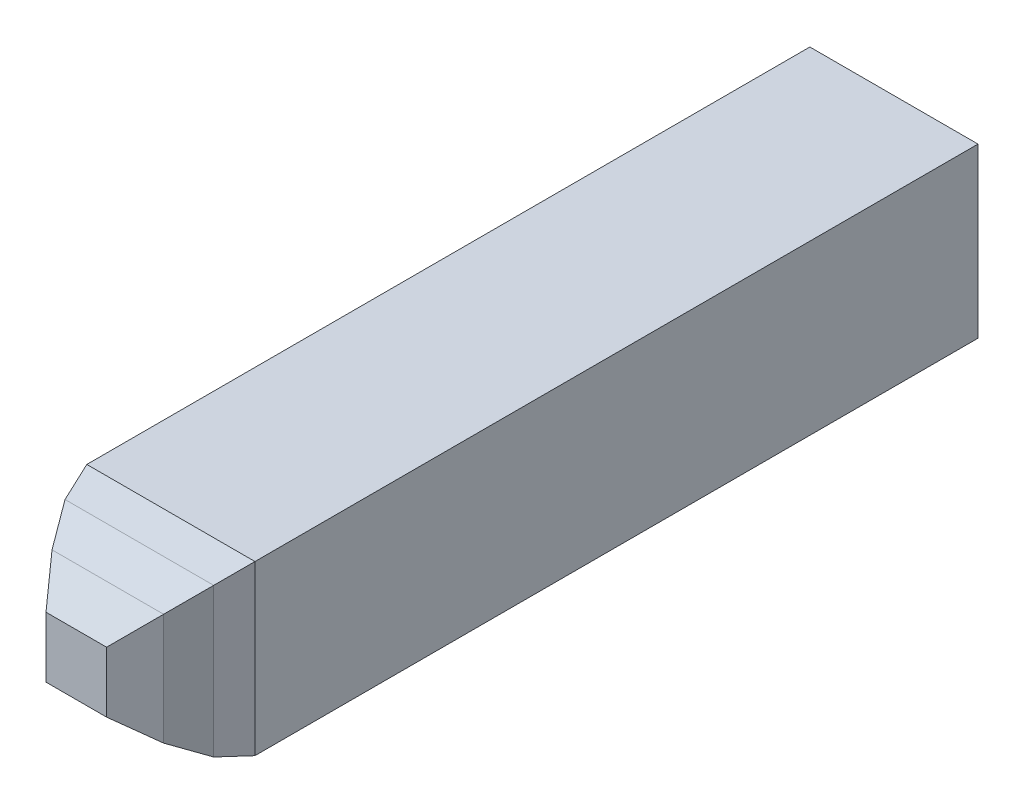
ISO-10303-21;
HEADER;
FILE_DESCRIPTION(('STEP AP214'),'2;1');
FILE_NAME('part.step','',(''),(''),'','','');
FILE_SCHEMA(('AUTOMOTIVE_DESIGN { 1 0 10303 214 1 1 1 1 }'));
ENDSEC;
DATA;
#1=APPLICATION_CONTEXT('core data for automotive mechanical design processes');
#2=APPLICATION_PROTOCOL_DEFINITION('international standard','automotive_design',2000,#1);
#3=PRODUCT_CONTEXT('',#1,'mechanical');
#4=PRODUCT('Part','Part','',(#3));
#5=PRODUCT_RELATED_PRODUCT_CATEGORY('part','',(#4));
#6=PRODUCT_DEFINITION_FORMATION('','',#4);
#7=PRODUCT_DEFINITION_CONTEXT('part definition',#1,'design');
#8=PRODUCT_DEFINITION('design','',#6,#7);
#9=PRODUCT_DEFINITION_SHAPE('','',#8);
#10=(LENGTH_UNIT() NAMED_UNIT(*) SI_UNIT(.MILLI.,.METRE.));
#11=(NAMED_UNIT(*) PLANE_ANGLE_UNIT() SI_UNIT($,.RADIAN.));
#12=(NAMED_UNIT(*) SI_UNIT($,.STERADIAN.) SOLID_ANGLE_UNIT());
#13=UNCERTAINTY_MEASURE_WITH_UNIT(LENGTH_MEASURE(1.E-05),#10,'distance_accuracy_value','');
#14=(GEOMETRIC_REPRESENTATION_CONTEXT(3) GLOBAL_UNCERTAINTY_ASSIGNED_CONTEXT((#13)) GLOBAL_UNIT_ASSIGNED_CONTEXT((#10,
#11,#12)) REPRESENTATION_CONTEXT('',''));
#15=CARTESIAN_POINT('',(0.,0.,0.));
#16=DIRECTION('',(0.,0.,1.));
#17=DIRECTION('',(1.,0.,0.));
#18=AXIS2_PLACEMENT_3D('',#15,#16,#17);
#19=CARTESIAN_POINT('',(-50.8,50.8,436.88));
#20=DIRECTION('',(0.,1.,0.));
#21=DIRECTION('',(0.,0.,1.));
#22=AXIS2_PLACEMENT_3D('',#19,#20,#21);
#23=PLANE('',#22);
#24=DIRECTION('',(1.,0.,0.));
#25=VECTOR('',#24,1.);
#26=CARTESIAN_POINT('',(-50.8,50.8,0.));
#27=LINE('',#26,#25);
#28=CARTESIAN_POINT('',(-50.8,50.8,0.));
#29=VERTEX_POINT('',#28);
#30=CARTESIAN_POINT('',(50.8,50.8,0.));
#31=VERTEX_POINT('',#30);
#32=EDGE_CURVE('E464',#29,#31,#27,.T.);
#33=ORIENTED_EDGE('',*,*,#32,.F.);
#34=DIRECTION('',(0.,0.,-1.));
#35=VECTOR('',#34,1.);
#36=CARTESIAN_POINT('',(-50.8,50.8,436.88));
#37=LINE('',#36,#35);
#38=CARTESIAN_POINT('',(-50.8,50.8,436.88));
#39=VERTEX_POINT('',#38);
#40=EDGE_CURVE('E12',#39,#29,#37,.T.);
#41=ORIENTED_EDGE('',*,*,#40,.F.);
#42=DIRECTION('',(1.,0.,0.));
#43=VECTOR('',#42,1.);
#44=CARTESIAN_POINT('',(-50.8,50.8,436.88));
#45=LINE('',#44,#43);
#46=CARTESIAN_POINT('',(50.8,50.8,436.88));
#47=VERTEX_POINT('',#46);
#48=EDGE_CURVE('E475',#39,#47,#45,.T.);
#49=ORIENTED_EDGE('',*,*,#48,.T.);
#50=DIRECTION('',(0.,0.,-1.));
#51=VECTOR('',#50,1.);
#52=CARTESIAN_POINT('',(50.8,50.8,436.88));
#53=LINE('',#52,#51);
#54=EDGE_CURVE('E476',#47,#31,#53,.T.);
#55=ORIENTED_EDGE('',*,*,#54,.T.);
#56=EDGE_LOOP('',(#33,#41,#49,#55));
#57=FACE_BOUND('',#56,.T.);
#58=ADVANCED_FACE('F63',(#57),#23,.T.);
#59=CARTESIAN_POINT('',(-50.8,-50.8,436.88));
#60=DIRECTION('',(-1.,0.,0.));
#61=DIRECTION('',(0.,0.,1.));
#62=AXIS2_PLACEMENT_3D('',#59,#60,#61);
#63=PLANE('',#62);
#64=DIRECTION('',(0.,1.,0.));
#65=VECTOR('',#64,1.);
#66=CARTESIAN_POINT('',(-50.8,-50.8,0.));
#67=LINE('',#66,#65);
#68=CARTESIAN_POINT('',(-50.8,-50.8,0.));
#69=VERTEX_POINT('',#68);
#70=EDGE_CURVE('E472',#69,#29,#67,.T.);
#71=ORIENTED_EDGE('',*,*,#70,.F.);
#72=DIRECTION('',(0.,0.,-1.));
#73=VECTOR('',#72,1.);
#74=CARTESIAN_POINT('',(-50.8,-50.8,436.88));
#75=LINE('',#74,#73);
#76=CARTESIAN_POINT('',(-50.8,-50.8,436.88));
#77=VERTEX_POINT('',#76);
#78=EDGE_CURVE('E73',#77,#69,#75,.T.);
#79=ORIENTED_EDGE('',*,*,#78,.F.);
#80=DIRECTION('',(0.,1.,0.));
#81=VECTOR('',#80,1.);
#82=CARTESIAN_POINT('',(-50.8,-50.8,436.88));
#83=LINE('',#82,#81);
#84=EDGE_CURVE('E478',#77,#39,#83,.T.);
#85=ORIENTED_EDGE('',*,*,#84,.T.);
#86=ORIENTED_EDGE('',*,*,#40,.T.);
#87=EDGE_LOOP('',(#71,#79,#85,#86));
#88=FACE_BOUND('',#87,.T.);
#89=ADVANCED_FACE('F492',(#88),#63,.T.);
#90=CARTESIAN_POINT('',(-50.8,-50.8,436.88));
#91=DIRECTION('',(0.,1.,0.));
#92=DIRECTION('',(0.,0.,1.));
#93=AXIS2_PLACEMENT_3D('',#90,#91,#92);
#94=PLANE('',#93);
#95=DIRECTION('',(1.,0.,0.));
#96=VECTOR('',#95,1.);
#97=CARTESIAN_POINT('',(-50.8,-50.8,0.));
#98=LINE('',#97,#96);
#99=CARTESIAN_POINT('',(50.8,-50.8,0.));
#100=VERTEX_POINT('',#99);
#101=EDGE_CURVE('E470',#69,#100,#98,.T.);
#102=ORIENTED_EDGE('',*,*,#101,.T.);
#103=DIRECTION('',(0.,0.,-1.));
#104=VECTOR('',#103,1.);
#105=CARTESIAN_POINT('',(50.8,-50.8,436.88));
#106=LINE('',#105,#104);
#107=CARTESIAN_POINT('',(50.8,-50.8,436.88));
#108=VERTEX_POINT('',#107);
#109=EDGE_CURVE('E92',#108,#100,#106,.T.);
#110=ORIENTED_EDGE('',*,*,#109,.F.);
#111=DIRECTION('',(1.,0.,0.));
#112=VECTOR('',#111,1.);
#113=CARTESIAN_POINT('',(0.,-50.8,436.88));
#114=LINE('',#113,#112);
#115=EDGE_CURVE('E481',#77,#108,#114,.T.);
#116=ORIENTED_EDGE('',*,*,#115,.F.);
#117=ORIENTED_EDGE('',*,*,#78,.T.);
#118=EDGE_LOOP('',(#102,#110,#116,#117));
#119=FACE_BOUND('',#118,.T.);
#120=ADVANCED_FACE('F494',(#119),#94,.F.);
#121=CARTESIAN_POINT('',(50.8,-50.8,436.88));
#122=DIRECTION('',(-1.,0.,0.));
#123=DIRECTION('',(0.,0.,1.));
#124=AXIS2_PLACEMENT_3D('',#121,#122,#123);
#125=PLANE('',#124);
#126=DIRECTION('',(0.,1.,0.));
#127=VECTOR('',#126,1.);
#128=CARTESIAN_POINT('',(50.8,-50.8,0.));
#129=LINE('',#128,#127);
#130=EDGE_CURVE('E467',#100,#31,#129,.T.);
#131=ORIENTED_EDGE('',*,*,#130,.T.);
#132=ORIENTED_EDGE('',*,*,#54,.F.);
#133=DIRECTION('',(0.,1.,0.));
#134=VECTOR('',#133,1.);
#135=CARTESIAN_POINT('',(50.8,0.,436.88));
#136=LINE('',#135,#134);
#137=EDGE_CURVE('E484',#108,#47,#136,.T.);
#138=ORIENTED_EDGE('',*,*,#137,.F.);
#139=ORIENTED_EDGE('',*,*,#109,.T.);
#140=EDGE_LOOP('',(#131,#132,#138,#139));
#141=FACE_BOUND('',#140,.T.);
#142=ADVANCED_FACE('F496',(#141),#125,.F.);
#143=CARTESIAN_POINT('',(0.,0.,0.));
#144=DIRECTION('',(0.,0.,1.));
#145=DIRECTION('',(1.,0.,0.));
#146=AXIS2_PLACEMENT_3D('',#143,#144,#145);
#147=PLANE('',#146);
#148=ORIENTED_EDGE('',*,*,#32,.T.);
#149=ORIENTED_EDGE('',*,*,#130,.F.);
#150=ORIENTED_EDGE('',*,*,#101,.F.);
#151=ORIENTED_EDGE('',*,*,#70,.T.);
#152=EDGE_LOOP('',(#148,#149,#150,#151));
#153=FACE_BOUND('',#152,.T.);
#154=ADVANCED_FACE('F339',(#153),#147,.F.);
#155=CARTESIAN_POINT('',(-169.607289220981,0.,52.4115345624845));
#156=DIRECTION('',(0.95542256350096,0.,-0.295241807935891));
#157=DIRECTION('',(-0.295241807935891,0.,-0.95542256350096));
#158=AXIS2_PLACEMENT_3D('',#155,#156,#157);
#159=PLANE('',#158);
#160=DIRECTION('',(0.283158485378097,0.283158485378098,0.916320110178077));
#161=VECTOR('',#160,1.);
#162=CARTESIAN_POINT('',(-50.8,-50.8,436.88));
#163=LINE('',#162,#161);
#164=CARTESIAN_POINT('',(-44.913226277,-44.913226277,455.93));
#165=VERTEX_POINT('',#164);
#166=EDGE_CURVE('E187',#77,#165,#163,.T.);
#167=ORIENTED_EDGE('',*,*,#166,.T.);
#168=DIRECTION('',(0.,-1.,0.));
#169=VECTOR('',#168,1.);
#170=CARTESIAN_POINT('',(-44.913226277,-44.913226277,455.93));
#171=LINE('',#170,#169);
#172=CARTESIAN_POINT('',(-44.913226277,44.913226277,455.93));
#173=VERTEX_POINT('',#172);
#174=EDGE_CURVE('E365',#173,#165,#171,.T.);
#175=ORIENTED_EDGE('',*,*,#174,.F.);
#176=DIRECTION('',(0.283158485378097,-0.283158485378098,0.916320110178077));
#177=VECTOR('',#176,1.);
#178=CARTESIAN_POINT('',(-50.8,50.8,436.88));
#179=LINE('',#178,#177);
#180=EDGE_CURVE('E292',#39,#173,#179,.T.);
#181=ORIENTED_EDGE('',*,*,#180,.F.);
#182=ORIENTED_EDGE('',*,*,#84,.F.);
#183=EDGE_LOOP('',(#167,#175,#181,#182));
#184=FACE_BOUND('',#183,.T.);
#185=ADVANCED_FACE('F371',(#184),#159,.F.);
#186=CARTESIAN_POINT('',(0.,169.607289220981,52.4115345624847));
#187=DIRECTION('',(0.,-0.95542256350096,-0.295241807935892));
#188=DIRECTION('',(0.,0.295241807935892,-0.95542256350096));
#189=AXIS2_PLACEMENT_3D('',#186,#187,#188);
#190=PLANE('',#189);
#191=ORIENTED_EDGE('',*,*,#180,.T.);
#192=DIRECTION('',(-1.,0.,0.));
#193=VECTOR('',#192,1.);
#194=CARTESIAN_POINT('',(-44.913226277,44.913226277,455.93));
#195=LINE('',#194,#193);
#196=CARTESIAN_POINT('',(44.913226277,44.913226277,455.93));
#197=VERTEX_POINT('',#196);
#198=EDGE_CURVE('E353',#197,#173,#195,.T.);
#199=ORIENTED_EDGE('',*,*,#198,.F.);
#200=DIRECTION('',(-0.283158485378098,-0.283158485378098,0.916320110178077));
#201=VECTOR('',#200,1.);
#202=CARTESIAN_POINT('',(50.8,50.8,436.88));
#203=LINE('',#202,#201);
#204=EDGE_CURVE('E302',#47,#197,#203,.T.);
#205=ORIENTED_EDGE('',*,*,#204,.F.);
#206=ORIENTED_EDGE('',*,*,#48,.F.);
#207=EDGE_LOOP('',(#191,#199,#205,#206));
#208=FACE_BOUND('',#207,.T.);
#209=ADVANCED_FACE('F331',(#208),#190,.F.);
#210=CARTESIAN_POINT('',(0.,-169.607289220981,52.4115345624846));
#211=DIRECTION('',(0.,0.95542256350096,-0.295241807935892));
#212=DIRECTION('',(0.,0.295241807935892,0.95542256350096));
#213=AXIS2_PLACEMENT_3D('',#210,#211,#212);
#214=PLANE('',#213);
#215=DIRECTION('',(-0.283158485378098,0.283158485378097,0.916320110178077));
#216=VECTOR('',#215,1.);
#217=CARTESIAN_POINT('',(50.8,-50.8,436.88));
#218=LINE('',#217,#216);
#219=CARTESIAN_POINT('',(44.913226277,-44.913226277,455.93));
#220=VERTEX_POINT('',#219);
#221=EDGE_CURVE('E295',#108,#220,#218,.T.);
#222=ORIENTED_EDGE('',*,*,#221,.T.);
#223=DIRECTION('',(1.,0.,0.));
#224=VECTOR('',#223,1.);
#225=CARTESIAN_POINT('',(-44.913226277,-44.913226277,455.93));
#226=LINE('',#225,#224);
#227=EDGE_CURVE('E153',#165,#220,#226,.T.);
#228=ORIENTED_EDGE('',*,*,#227,.F.);
#229=ORIENTED_EDGE('',*,*,#166,.F.);
#230=ORIENTED_EDGE('',*,*,#115,.T.);
#231=EDGE_LOOP('',(#222,#228,#229,#230));
#232=FACE_BOUND('',#231,.T.);
#233=ADVANCED_FACE('F320',(#232),#214,.F.);
#234=CARTESIAN_POINT('',(169.607289220982,0.,52.4115345624849));
#235=DIRECTION('',(-0.95542256350096,0.,-0.295241807935893));
#236=DIRECTION('',(-0.295241807935893,0.,0.95542256350096));
#237=AXIS2_PLACEMENT_3D('',#234,#235,#236);
#238=PLANE('',#237);
#239=ORIENTED_EDGE('',*,*,#204,.T.);
#240=DIRECTION('',(0.,1.,0.));
#241=VECTOR('',#240,1.);
#242=CARTESIAN_POINT('',(44.913226277,-44.913226277,455.93));
#243=LINE('',#242,#241);
#244=EDGE_CURVE('E307',#220,#197,#243,.T.);
#245=ORIENTED_EDGE('',*,*,#244,.F.);
#246=ORIENTED_EDGE('',*,*,#221,.F.);
#247=ORIENTED_EDGE('',*,*,#137,.T.);
#248=EDGE_LOOP('',(#239,#245,#246,#247));
#249=FACE_BOUND('',#248,.T.);
#250=ADVANCED_FACE('F330',(#249),#238,.F.);
#251=CARTESIAN_POINT('',(-232.556025727877,0.,136.693002496654));
#252=DIRECTION('',(0.862103722004972,0.,-0.506731854638303));
#253=DIRECTION('',(-0.506731854638303,0.,-0.862103722004972));
#254=AXIS2_PLACEMENT_3D('',#251,#252,#253);
#255=PLANE('',#254);
#256=DIRECTION('',(0.452011063103409,0.452011062302979,0.769007151064187));
#257=VECTOR('',#256,1.);
#258=CARTESIAN_POINT('',(-44.913226277,-44.913226277,455.93));
#259=LINE('',#258,#257);
#260=CARTESIAN_POINT('',(-33.715917201,-33.7159172208284,474.98));
#261=VERTEX_POINT('',#260);
#262=EDGE_CURVE('E425',#165,#261,#259,.T.);
#263=ORIENTED_EDGE('',*,*,#262,.T.);
#264=DIRECTION('',(0.,-1.,0.));
#265=VECTOR('',#264,1.);
#266=CARTESIAN_POINT('',(-33.715917201,-33.7159172208284,474.98));
#267=LINE('',#266,#265);
#268=CARTESIAN_POINT('',(-33.715917201,33.7159172208284,474.98));
#269=VERTEX_POINT('',#268);
#270=EDGE_CURVE('E188',#269,#261,#267,.T.);
#271=ORIENTED_EDGE('',*,*,#270,.F.);
#272=DIRECTION('',(0.452011063103409,-0.452011062302979,0.769007151064188));
#273=VECTOR('',#272,1.);
#274=CARTESIAN_POINT('',(-44.913226277,44.913226277,455.93));
#275=LINE('',#274,#273);
#276=EDGE_CURVE('E158',#173,#269,#275,.T.);
#277=ORIENTED_EDGE('',*,*,#276,.F.);
#278=ORIENTED_EDGE('',*,*,#174,.T.);
#279=EDGE_LOOP('',(#263,#271,#277,#278));
#280=FACE_BOUND('',#279,.T.);
#281=ADVANCED_FACE('F337',(#280),#255,.F.);
#282=CARTESIAN_POINT('',(0.,232.556025586663,136.693002171591));
#283=DIRECTION('',(0.,-0.862103722396976,-0.506731853971386));
#284=DIRECTION('',(0.,0.506731853971386,-0.862103722396976));
#285=AXIS2_PLACEMENT_3D('',#282,#283,#284);
#286=PLANE('',#285);
#287=ORIENTED_EDGE('',*,*,#276,.T.);
#288=DIRECTION('',(-1.,0.,0.));
#289=VECTOR('',#288,1.);
#290=CARTESIAN_POINT('',(-33.715917201,33.7159172208284,474.98));
#291=LINE('',#290,#289);
#292=CARTESIAN_POINT('',(33.715917201,33.7159172208284,474.98));
#293=VERTEX_POINT('',#292);
#294=EDGE_CURVE('E170',#293,#269,#291,.T.);
#295=ORIENTED_EDGE('',*,*,#294,.F.);
#296=DIRECTION('',(-0.452011063103408,-0.452011062302979,0.769007151064188));
#297=VECTOR('',#296,1.);
#298=CARTESIAN_POINT('',(44.913226277,44.913226277,455.93));
#299=LINE('',#298,#297);
#300=EDGE_CURVE('E157',#197,#293,#299,.T.);
#301=ORIENTED_EDGE('',*,*,#300,.F.);
#302=ORIENTED_EDGE('',*,*,#198,.T.);
#303=EDGE_LOOP('',(#287,#295,#301,#302));
#304=FACE_BOUND('',#303,.T.);
#305=ADVANCED_FACE('F403',(#304),#286,.F.);
#306=CARTESIAN_POINT('',(0.,-232.556025586663,136.693002171591));
#307=DIRECTION('',(0.,0.862103722396976,-0.506731853971386));
#308=DIRECTION('',(0.,0.506731853971386,0.862103722396976));
#309=AXIS2_PLACEMENT_3D('',#306,#307,#308);
#310=PLANE('',#309);
#311=DIRECTION('',(-0.452011063103407,0.45201106230298,0.769007151064188));
#312=VECTOR('',#311,1.);
#313=CARTESIAN_POINT('',(44.913226277,-44.913226277,455.93));
#314=LINE('',#313,#312);
#315=CARTESIAN_POINT('',(33.715917201,-33.7159172208284,474.98));
#316=VERTEX_POINT('',#315);
#317=EDGE_CURVE('E144',#220,#316,#314,.T.);
#318=ORIENTED_EDGE('',*,*,#317,.T.);
#319=DIRECTION('',(1.,0.,0.));
#320=VECTOR('',#319,1.);
#321=CARTESIAN_POINT('',(-33.715917201,-33.7159172208284,474.98));
#322=LINE('',#321,#320);
#323=EDGE_CURVE('E149',#261,#316,#322,.T.);
#324=ORIENTED_EDGE('',*,*,#323,.F.);
#325=ORIENTED_EDGE('',*,*,#262,.F.);
#326=ORIENTED_EDGE('',*,*,#227,.T.);
#327=EDGE_LOOP('',(#318,#324,#325,#326));
#328=FACE_BOUND('',#327,.T.);
#329=ADVANCED_FACE('F146',(#328),#310,.F.);
#330=CARTESIAN_POINT('',(232.556025727877,0.,136.693002496653));
#331=DIRECTION('',(-0.862103722004973,0.,-0.506731854638301));
#332=DIRECTION('',(-0.506731854638301,0.,0.862103722004973));
#333=AXIS2_PLACEMENT_3D('',#330,#331,#332);
#334=PLANE('',#333);
#335=ORIENTED_EDGE('',*,*,#300,.T.);
#336=DIRECTION('',(0.,1.,0.));
#337=VECTOR('',#336,1.);
#338=CARTESIAN_POINT('',(33.715917201,-33.7159172208284,474.98));
#339=LINE('',#338,#337);
#340=EDGE_CURVE('E66',#316,#293,#339,.T.);
#341=ORIENTED_EDGE('',*,*,#340,.F.);
#342=ORIENTED_EDGE('',*,*,#317,.F.);
#343=ORIENTED_EDGE('',*,*,#244,.T.);
#344=EDGE_LOOP('',(#335,#341,#342,#343));
#345=FACE_BOUND('',#344,.T.);
#346=ADVANCED_FACE('F164',(#345),#334,.F.);
#347=CARTESIAN_POINT('',(0.,0.,494.03));
#348=DIRECTION('',(0.,0.,-1.));
#349=DIRECTION('',(-1.,0.,0.));
#350=AXIS2_PLACEMENT_3D('',#347,#348,#349);
#351=PLANE('',#350);
#352=DIRECTION('',(0.,1.,0.));
#353=VECTOR('',#352,1.);
#354=CARTESIAN_POINT('',(18.304143478,-18.3041434581573,494.03));
#355=LINE('',#354,#353);
#356=CARTESIAN_POINT('',(18.304143478,-18.3041434581573,494.03));
#357=VERTEX_POINT('',#356);
#358=CARTESIAN_POINT('',(18.304143478,18.3041434581572,494.03));
#359=VERTEX_POINT('',#358);
#360=EDGE_CURVE('E178',#357,#359,#355,.T.);
#361=ORIENTED_EDGE('',*,*,#360,.T.);
#362=DIRECTION('',(-1.,0.,0.));
#363=VECTOR('',#362,1.);
#364=CARTESIAN_POINT('',(-18.304143478,18.3041434581572,494.03));
#365=LINE('',#364,#363);
#366=CARTESIAN_POINT('',(-18.304143478,18.3041434581572,494.03));
#367=VERTEX_POINT('',#366);
#368=EDGE_CURVE('E620',#359,#367,#365,.T.);
#369=ORIENTED_EDGE('',*,*,#368,.T.);
#370=DIRECTION('',(0.,-1.,0.));
#371=VECTOR('',#370,1.);
#372=CARTESIAN_POINT('',(-18.304143478,-18.3041434581573,494.03));
#373=LINE('',#372,#371);
#374=CARTESIAN_POINT('',(-18.304143478,-18.3041434581573,494.03));
#375=VERTEX_POINT('',#374);
#376=EDGE_CURVE('E446',#367,#375,#373,.T.);
#377=ORIENTED_EDGE('',*,*,#376,.T.);
#378=DIRECTION('',(1.,0.,0.));
#379=VECTOR('',#378,1.);
#380=CARTESIAN_POINT('',(-18.304143478,-18.3041434581573,494.03));
#381=LINE('',#380,#379);
#382=EDGE_CURVE('E444',#375,#357,#381,.T.);
#383=ORIENTED_EDGE('',*,*,#382,.T.);
#384=EDGE_LOOP('',(#361,#369,#377,#383));
#385=FACE_BOUND('',#384,.T.);
#386=ADVANCED_FACE('F208',(#385),#351,.F.);
#387=CARTESIAN_POINT('',(0.,252.632615661082,204.384079666165));
#388=DIRECTION('',(0.,-0.777437524425454,-0.628960170134184));
#389=DIRECTION('',(0.,0.628960170134184,-0.777437524425454));
#390=AXIS2_PLACEMENT_3D('',#387,#388,#389);
#391=PLANE('',#390);
#392=DIRECTION('',(0.532407395338515,-0.532407396708975,0.658091733209307));
#393=VECTOR('',#392,1.);
#394=CARTESIAN_POINT('',(-33.715917201,33.7159172208284,474.98));
#395=LINE('',#394,#393);
#396=EDGE_CURVE('E250',#269,#367,#395,.T.);
#397=ORIENTED_EDGE('',*,*,#396,.T.);
#398=ORIENTED_EDGE('',*,*,#368,.F.);
#399=DIRECTION('',(-0.532407395338516,-0.532407396708975,0.658091733209307));
#400=VECTOR('',#399,1.);
#401=CARTESIAN_POINT('',(33.715917201,33.7159172208284,474.98));
#402=LINE('',#401,#400);
#403=EDGE_CURVE('E243',#293,#359,#402,.T.);
#404=ORIENTED_EDGE('',*,*,#403,.F.);
#405=ORIENTED_EDGE('',*,*,#294,.T.);
#406=EDGE_LOOP('',(#397,#398,#404,#405));
#407=FACE_BOUND('',#406,.T.);
#408=ADVANCED_FACE('F235',(#407),#391,.F.);
#409=CARTESIAN_POINT('',(252.632615565759,0.,204.384079062947));
#410=DIRECTION('',(-0.777437525217105,0.,-0.62896016915565));
#411=DIRECTION('',(-0.62896016915565,0.,0.777437525217105));
#412=AXIS2_PLACEMENT_3D('',#409,#410,#411);
#413=PLANE('',#412);
#414=ORIENTED_EDGE('',*,*,#403,.T.);
#415=ORIENTED_EDGE('',*,*,#360,.F.);
#416=DIRECTION('',(-0.532407395338516,0.532407396708974,0.658091733209307));
#417=VECTOR('',#416,1.);
#418=CARTESIAN_POINT('',(33.715917201,-33.7159172208284,474.98));
#419=LINE('',#418,#417);
#420=EDGE_CURVE('E175',#316,#357,#419,.T.);
#421=ORIENTED_EDGE('',*,*,#420,.F.);
#422=ORIENTED_EDGE('',*,*,#340,.T.);
#423=EDGE_LOOP('',(#414,#415,#421,#422));
#424=FACE_BOUND('',#423,.T.);
#425=ADVANCED_FACE('F176',(#424),#413,.F.);
#426=CARTESIAN_POINT('',(-252.632615565759,0.,204.384079062946));
#427=DIRECTION('',(0.777437525217106,0.,-0.628960169155649));
#428=DIRECTION('',(-0.628960169155649,0.,-0.777437525217106));
#429=AXIS2_PLACEMENT_3D('',#426,#427,#428);
#430=PLANE('',#429);
#431=DIRECTION('',(0.532407395338515,0.532407396708975,0.658091733209308));
#432=VECTOR('',#431,1.);
#433=CARTESIAN_POINT('',(-33.715917201,-33.7159172208284,474.98));
#434=LINE('',#433,#432);
#435=EDGE_CURVE('E182',#261,#375,#434,.T.);
#436=ORIENTED_EDGE('',*,*,#435,.T.);
#437=ORIENTED_EDGE('',*,*,#376,.F.);
#438=ORIENTED_EDGE('',*,*,#396,.F.);
#439=ORIENTED_EDGE('',*,*,#270,.T.);
#440=EDGE_LOOP('',(#436,#437,#438,#439));
#441=FACE_BOUND('',#440,.T.);
#442=ADVANCED_FACE('F205',(#441),#430,.F.);
#443=CARTESIAN_POINT('',(0.,-252.632615661082,204.384079666165));
#444=DIRECTION('',(0.,0.777437524425454,-0.628960170134184));
#445=DIRECTION('',(0.,0.628960170134184,0.777437524425454));
#446=AXIS2_PLACEMENT_3D('',#443,#444,#445);
#447=PLANE('',#446);
#448=ORIENTED_EDGE('',*,*,#420,.T.);
#449=ORIENTED_EDGE('',*,*,#382,.F.);
#450=ORIENTED_EDGE('',*,*,#435,.F.);
#451=ORIENTED_EDGE('',*,*,#323,.T.);
#452=EDGE_LOOP('',(#448,#449,#450,#451));
#453=FACE_BOUND('',#452,.T.);
#454=ADVANCED_FACE('F186',(#453),#447,.F.);
#455=CLOSED_SHELL('',(#58,#89,#120,#142,#154,#185,#209,#233,#250,#281,#305,#329,#346,#386,#408,
#425,#442,#454));
#456=MANIFOLD_SOLID_BREP('B2',#455);
#457=ADVANCED_BREP_SHAPE_REPRESENTATION('',(#18,#456),#14);
#458=SHAPE_DEFINITION_REPRESENTATION(#9,#457);
ENDSEC;
END-ISO-10303-21;
